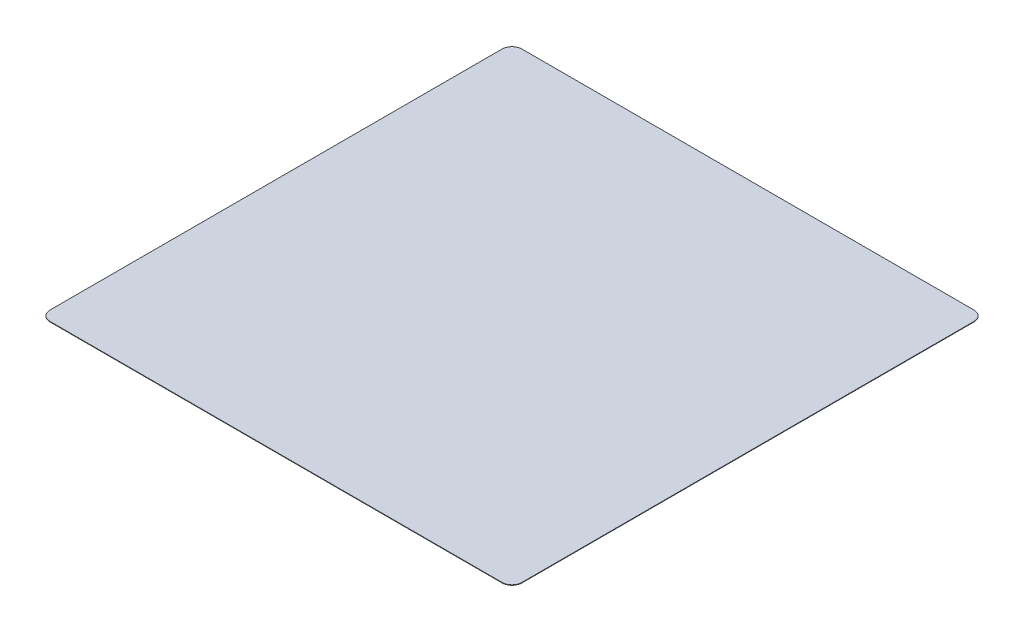
ISO-10303-21;
HEADER;
FILE_DESCRIPTION(('STEP AP214'),'2;1');
FILE_NAME('part.step','',(''),(''),'','','');
FILE_SCHEMA(('AUTOMOTIVE_DESIGN { 1 0 10303 214 1 1 1 1 }'));
ENDSEC;
DATA;
#1=APPLICATION_CONTEXT('core data for automotive mechanical design processes');
#2=APPLICATION_PROTOCOL_DEFINITION('international standard','automotive_design',2000,#1);
#3=PRODUCT_CONTEXT('',#1,'mechanical');
#4=PRODUCT('Part','Part','',(#3));
#5=PRODUCT_RELATED_PRODUCT_CATEGORY('part','',(#4));
#6=PRODUCT_DEFINITION_FORMATION('','',#4);
#7=PRODUCT_DEFINITION_CONTEXT('part definition',#1,'design');
#8=PRODUCT_DEFINITION('design','',#6,#7);
#9=PRODUCT_DEFINITION_SHAPE('','',#8);
#10=(LENGTH_UNIT() NAMED_UNIT(*) SI_UNIT(.MILLI.,.METRE.));
#11=(NAMED_UNIT(*) PLANE_ANGLE_UNIT() SI_UNIT($,.RADIAN.));
#12=(NAMED_UNIT(*) SI_UNIT($,.STERADIAN.) SOLID_ANGLE_UNIT());
#13=UNCERTAINTY_MEASURE_WITH_UNIT(LENGTH_MEASURE(1.E-05),#10,'distance_accuracy_value','');
#14=(GEOMETRIC_REPRESENTATION_CONTEXT(3) GLOBAL_UNCERTAINTY_ASSIGNED_CONTEXT((#13)) GLOBAL_UNIT_ASSIGNED_CONTEXT((#10,
#11,#12)) REPRESENTATION_CONTEXT('',''));
#15=CARTESIAN_POINT('',(0.,0.,0.));
#16=DIRECTION('',(0.,0.,1.));
#17=DIRECTION('',(1.,0.,0.));
#18=AXIS2_PLACEMENT_3D('',#15,#16,#17);
#19=CARTESIAN_POINT('',(47.35,0.1,47.35));
#20=DIRECTION('',(-1.,0.,0.));
#21=DIRECTION('',(0.,0.,1.));
#22=AXIS2_PLACEMENT_3D('',#19,#20,#21);
#23=PLANE('',#22);
#24=DIRECTION('',(0.,0.,-1.));
#25=VECTOR('',#24,1.);
#26=CARTESIAN_POINT('',(47.35,0.,47.35));
#27=LINE('',#26,#25);
#28=CARTESIAN_POINT('',(47.35,0.,45.35));
#29=VERTEX_POINT('',#28);
#30=CARTESIAN_POINT('',(47.35,0.,-45.35));
#31=VERTEX_POINT('',#30);
#32=EDGE_CURVE('E128',#29,#31,#27,.T.);
#33=ORIENTED_EDGE('',*,*,#32,.T.);
#34=DIRECTION('',(0.,-1.,0.));
#35=VECTOR('',#34,1.);
#36=CARTESIAN_POINT('',(47.35,0.1,-45.35));
#37=LINE('',#36,#35);
#38=CARTESIAN_POINT('',(47.35,0.1,-45.35));
#39=VERTEX_POINT('',#38);
#40=EDGE_CURVE('E151',#31,#39,#37,.F.);
#41=ORIENTED_EDGE('',*,*,#40,.T.);
#42=DIRECTION('',(0.,0.,-1.));
#43=VECTOR('',#42,1.);
#44=CARTESIAN_POINT('',(47.35,0.1,47.35));
#45=LINE('',#44,#43);
#46=CARTESIAN_POINT('',(47.35,0.1,45.35));
#47=VERTEX_POINT('',#46);
#48=EDGE_CURVE('E126',#47,#39,#45,.T.);
#49=ORIENTED_EDGE('',*,*,#48,.F.);
#50=DIRECTION('',(0.,-1.,0.));
#51=VECTOR('',#50,1.);
#52=CARTESIAN_POINT('',(47.35,0.1,45.35));
#53=LINE('',#52,#51);
#54=EDGE_CURVE('E148',#47,#29,#53,.T.);
#55=ORIENTED_EDGE('',*,*,#54,.T.);
#56=EDGE_LOOP('',(#33,#41,#49,#55));
#57=FACE_BOUND('',#56,.T.);
#58=ADVANCED_FACE('F33',(#57),#23,.F.);
#59=CARTESIAN_POINT('',(-47.35,0.1,-47.35));
#60=DIRECTION('',(0.,0.,1.));
#61=DIRECTION('',(1.,0.,0.));
#62=AXIS2_PLACEMENT_3D('',#59,#60,#61);
#63=PLANE('',#62);
#64=DIRECTION('',(-1.,0.,0.));
#65=VECTOR('',#64,1.);
#66=CARTESIAN_POINT('',(-47.35,0.,-47.35));
#67=LINE('',#66,#65);
#68=CARTESIAN_POINT('',(45.35,0.,-47.35));
#69=VERTEX_POINT('',#68);
#70=CARTESIAN_POINT('',(-45.35,0.,-47.35));
#71=VERTEX_POINT('',#70);
#72=EDGE_CURVE('E124',#69,#71,#67,.T.);
#73=ORIENTED_EDGE('',*,*,#72,.T.);
#74=DIRECTION('',(0.,-1.,0.));
#75=VECTOR('',#74,1.);
#76=CARTESIAN_POINT('',(-45.35,0.1,-47.35));
#77=LINE('',#76,#75);
#78=CARTESIAN_POINT('',(-45.35,0.1,-47.35));
#79=VERTEX_POINT('',#78);
#80=EDGE_CURVE('E103',#71,#79,#77,.F.);
#81=ORIENTED_EDGE('',*,*,#80,.T.);
#82=DIRECTION('',(-1.,0.,0.));
#83=VECTOR('',#82,1.);
#84=CARTESIAN_POINT('',(-47.35,0.1,-47.35));
#85=LINE('',#84,#83);
#86=CARTESIAN_POINT('',(45.35,0.1,-47.35));
#87=VERTEX_POINT('',#86);
#88=EDGE_CURVE('E167',#87,#79,#85,.T.);
#89=ORIENTED_EDGE('',*,*,#88,.F.);
#90=DIRECTION('',(0.,-1.,0.));
#91=VECTOR('',#90,1.);
#92=CARTESIAN_POINT('',(45.35,0.1,-47.35));
#93=LINE('',#92,#91);
#94=EDGE_CURVE('E108',#87,#69,#93,.T.);
#95=ORIENTED_EDGE('',*,*,#94,.T.);
#96=EDGE_LOOP('',(#73,#81,#89,#95));
#97=FACE_BOUND('',#96,.T.);
#98=ADVANCED_FACE('F184',(#97),#63,.F.);
#99=CARTESIAN_POINT('',(-47.35,0.1,47.35));
#100=DIRECTION('',(1.,0.,0.));
#101=DIRECTION('',(0.,0.,-1.));
#102=AXIS2_PLACEMENT_3D('',#99,#100,#101);
#103=PLANE('',#102);
#104=DIRECTION('',(0.,0.,1.));
#105=VECTOR('',#104,1.);
#106=CARTESIAN_POINT('',(-47.35,0.1,47.35));
#107=LINE('',#106,#105);
#108=CARTESIAN_POINT('',(-47.35,0.1,-45.35));
#109=VERTEX_POINT('',#108);
#110=CARTESIAN_POINT('',(-47.35,0.1,45.35));
#111=VERTEX_POINT('',#110);
#112=EDGE_CURVE('E117',#109,#111,#107,.T.);
#113=ORIENTED_EDGE('',*,*,#112,.F.);
#114=DIRECTION('',(0.,-1.,0.));
#115=VECTOR('',#114,1.);
#116=CARTESIAN_POINT('',(-47.35,0.1,-45.35));
#117=LINE('',#116,#115);
#118=CARTESIAN_POINT('',(-47.35,0.,-45.35));
#119=VERTEX_POINT('',#118);
#120=EDGE_CURVE('E102',#109,#119,#117,.T.);
#121=ORIENTED_EDGE('',*,*,#120,.T.);
#122=DIRECTION('',(0.,0.,1.));
#123=VECTOR('',#122,1.);
#124=CARTESIAN_POINT('',(-47.35,0.,47.35));
#125=LINE('',#124,#123);
#126=CARTESIAN_POINT('',(-47.35,0.,45.35));
#127=VERTEX_POINT('',#126);
#128=EDGE_CURVE('E115',#119,#127,#125,.T.);
#129=ORIENTED_EDGE('',*,*,#128,.T.);
#130=DIRECTION('',(0.,-1.,0.));
#131=VECTOR('',#130,1.);
#132=CARTESIAN_POINT('',(-47.35,0.1,45.35));
#133=LINE('',#132,#131);
#134=EDGE_CURVE('E119',#127,#111,#133,.F.);
#135=ORIENTED_EDGE('',*,*,#134,.T.);
#136=EDGE_LOOP('',(#113,#121,#129,#135));
#137=FACE_BOUND('',#136,.T.);
#138=ADVANCED_FACE('F114',(#137),#103,.F.);
#139=CARTESIAN_POINT('',(-47.35,0.1,47.35));
#140=DIRECTION('',(0.,0.,-1.));
#141=DIRECTION('',(-1.,0.,0.));
#142=AXIS2_PLACEMENT_3D('',#139,#140,#141);
#143=PLANE('',#142);
#144=DIRECTION('',(1.,0.,0.));
#145=VECTOR('',#144,1.);
#146=CARTESIAN_POINT('',(-47.35,0.,47.35));
#147=LINE('',#146,#145);
#148=CARTESIAN_POINT('',(-45.35,0.,47.35));
#149=VERTEX_POINT('',#148);
#150=CARTESIAN_POINT('',(45.35,0.,47.35));
#151=VERTEX_POINT('',#150);
#152=EDGE_CURVE('E123',#149,#151,#147,.T.);
#153=ORIENTED_EDGE('',*,*,#152,.T.);
#154=DIRECTION('',(0.,-1.,0.));
#155=VECTOR('',#154,1.);
#156=CARTESIAN_POINT('',(45.35,0.1,47.35));
#157=LINE('',#156,#155);
#158=CARTESIAN_POINT('',(45.35,0.1,47.35));
#159=VERTEX_POINT('',#158);
#160=EDGE_CURVE('E11',#151,#159,#157,.F.);
#161=ORIENTED_EDGE('',*,*,#160,.T.);
#162=DIRECTION('',(1.,0.,0.));
#163=VECTOR('',#162,1.);
#164=CARTESIAN_POINT('',(-47.35,0.1,47.35));
#165=LINE('',#164,#163);
#166=CARTESIAN_POINT('',(-45.35,0.1,47.35));
#167=VERTEX_POINT('',#166);
#168=EDGE_CURVE('E132',#167,#159,#165,.T.);
#169=ORIENTED_EDGE('',*,*,#168,.F.);
#170=DIRECTION('',(0.,-1.,0.));
#171=VECTOR('',#170,1.);
#172=CARTESIAN_POINT('',(-45.35,0.1,47.35));
#173=LINE('',#172,#171);
#174=EDGE_CURVE('E41',#167,#149,#173,.T.);
#175=ORIENTED_EDGE('',*,*,#174,.T.);
#176=EDGE_LOOP('',(#153,#161,#169,#175));
#177=FACE_BOUND('',#176,.T.);
#178=ADVANCED_FACE('F154',(#177),#143,.F.);
#179=CARTESIAN_POINT('',(0.,0.1,0.));
#180=DIRECTION('',(0.,-1.,0.));
#181=DIRECTION('',(0.,0.,-1.));
#182=AXIS2_PLACEMENT_3D('',#179,#180,#181);
#183=PLANE('',#182);
#184=ORIENTED_EDGE('',*,*,#88,.T.);
#185=CARTESIAN_POINT('',(-45.35,0.1,-45.35));
#186=DIRECTION('',(0.,-1.,0.));
#187=DIRECTION('',(0.,0.,-1.));
#188=AXIS2_PLACEMENT_3D('',#185,#186,#187);
#189=CIRCLE('',#188,2.);
#190=EDGE_CURVE('E146',#79,#109,#189,.F.);
#191=ORIENTED_EDGE('',*,*,#190,.T.);
#192=ORIENTED_EDGE('',*,*,#112,.T.);
#193=CARTESIAN_POINT('',(-45.35,0.1,45.35));
#194=DIRECTION('',(0.,-1.,0.));
#195=DIRECTION('',(0.,0.,-1.));
#196=AXIS2_PLACEMENT_3D('',#193,#194,#195);
#197=CIRCLE('',#196,2.);
#198=EDGE_CURVE('E53',#111,#167,#197,.F.);
#199=ORIENTED_EDGE('',*,*,#198,.T.);
#200=ORIENTED_EDGE('',*,*,#168,.T.);
#201=CARTESIAN_POINT('',(45.35,0.1,45.35));
#202=DIRECTION('',(0.,-1.,0.));
#203=DIRECTION('',(0.,0.,-1.));
#204=AXIS2_PLACEMENT_3D('',#201,#202,#203);
#205=CIRCLE('',#204,2.);
#206=EDGE_CURVE('E142',#159,#47,#205,.F.);
#207=ORIENTED_EDGE('',*,*,#206,.T.);
#208=ORIENTED_EDGE('',*,*,#48,.T.);
#209=CARTESIAN_POINT('',(45.35,0.1,-45.35));
#210=DIRECTION('',(0.,-1.,0.));
#211=DIRECTION('',(0.,0.,-1.));
#212=AXIS2_PLACEMENT_3D('',#209,#210,#211);
#213=CIRCLE('',#212,2.);
#214=EDGE_CURVE('E144',#39,#87,#213,.F.);
#215=ORIENTED_EDGE('',*,*,#214,.T.);
#216=EDGE_LOOP('',(#184,#191,#192,#199,#200,#207,#208,#215));
#217=FACE_BOUND('',#216,.T.);
#218=ADVANCED_FACE('F173',(#217),#183,.F.);
#219=CARTESIAN_POINT('',(0.,0.,0.));
#220=DIRECTION('',(0.,-1.,0.));
#221=DIRECTION('',(0.,0.,-1.));
#222=AXIS2_PLACEMENT_3D('',#219,#220,#221);
#223=PLANE('',#222);
#224=ORIENTED_EDGE('',*,*,#128,.F.);
#225=CARTESIAN_POINT('',(-45.35,0.,-45.35));
#226=DIRECTION('',(0.,-1.,0.));
#227=DIRECTION('',(0.,0.,-1.));
#228=AXIS2_PLACEMENT_3D('',#225,#226,#227);
#229=CIRCLE('',#228,2.);
#230=EDGE_CURVE('E98',#119,#71,#229,.T.);
#231=ORIENTED_EDGE('',*,*,#230,.T.);
#232=ORIENTED_EDGE('',*,*,#72,.F.);
#233=CARTESIAN_POINT('',(45.35,0.,-45.35));
#234=DIRECTION('',(0.,-1.,0.));
#235=DIRECTION('',(0.,0.,-1.));
#236=AXIS2_PLACEMENT_3D('',#233,#234,#235);
#237=CIRCLE('',#236,2.);
#238=EDGE_CURVE('E109',#69,#31,#237,.T.);
#239=ORIENTED_EDGE('',*,*,#238,.T.);
#240=ORIENTED_EDGE('',*,*,#32,.F.);
#241=CARTESIAN_POINT('',(45.35,0.,45.35));
#242=DIRECTION('',(0.,-1.,0.));
#243=DIRECTION('',(0.,0.,-1.));
#244=AXIS2_PLACEMENT_3D('',#241,#242,#243);
#245=CIRCLE('',#244,2.);
#246=EDGE_CURVE('E135',#29,#151,#245,.T.);
#247=ORIENTED_EDGE('',*,*,#246,.T.);
#248=ORIENTED_EDGE('',*,*,#152,.F.);
#249=CARTESIAN_POINT('',(-45.35,0.,45.35));
#250=DIRECTION('',(0.,-1.,0.));
#251=DIRECTION('',(0.,0.,-1.));
#252=AXIS2_PLACEMENT_3D('',#249,#250,#251);
#253=CIRCLE('',#252,2.);
#254=EDGE_CURVE('E118',#149,#127,#253,.T.);
#255=ORIENTED_EDGE('',*,*,#254,.T.);
#256=EDGE_LOOP('',(#224,#231,#232,#239,#240,#247,#248,#255));
#257=FACE_BOUND('',#256,.T.);
#258=ADVANCED_FACE('F121',(#257),#223,.T.);
#259=CARTESIAN_POINT('',(-45.35,0.1,-45.35));
#260=DIRECTION('',(0.,-1.,0.));
#261=DIRECTION('',(0.,0.,-1.));
#262=AXIS2_PLACEMENT_3D('',#259,#260,#261);
#263=CYLINDRICAL_SURFACE('',#262,2.);
#264=ORIENTED_EDGE('',*,*,#190,.F.);
#265=ORIENTED_EDGE('',*,*,#80,.F.);
#266=ORIENTED_EDGE('',*,*,#230,.F.);
#267=ORIENTED_EDGE('',*,*,#120,.F.);
#268=EDGE_LOOP('',(#264,#265,#266,#267));
#269=FACE_BOUND('',#268,.T.);
#270=ADVANCED_FACE('F101',(#269),#263,.T.);
#271=CARTESIAN_POINT('',(45.35,0.1,-45.35));
#272=DIRECTION('',(0.,-1.,0.));
#273=DIRECTION('',(0.,0.,-1.));
#274=AXIS2_PLACEMENT_3D('',#271,#272,#273);
#275=CYLINDRICAL_SURFACE('',#274,2.);
#276=ORIENTED_EDGE('',*,*,#214,.F.);
#277=ORIENTED_EDGE('',*,*,#40,.F.);
#278=ORIENTED_EDGE('',*,*,#238,.F.);
#279=ORIENTED_EDGE('',*,*,#94,.F.);
#280=EDGE_LOOP('',(#276,#277,#278,#279));
#281=FACE_BOUND('',#280,.T.);
#282=ADVANCED_FACE('F195',(#281),#275,.T.);
#283=CARTESIAN_POINT('',(45.35,0.1,45.35));
#284=DIRECTION('',(0.,-1.,0.));
#285=DIRECTION('',(0.,0.,-1.));
#286=AXIS2_PLACEMENT_3D('',#283,#284,#285);
#287=CYLINDRICAL_SURFACE('',#286,2.);
#288=ORIENTED_EDGE('',*,*,#206,.F.);
#289=ORIENTED_EDGE('',*,*,#160,.F.);
#290=ORIENTED_EDGE('',*,*,#246,.F.);
#291=ORIENTED_EDGE('',*,*,#54,.F.);
#292=EDGE_LOOP('',(#288,#289,#290,#291));
#293=FACE_BOUND('',#292,.T.);
#294=ADVANCED_FACE('F161',(#293),#287,.T.);
#295=CARTESIAN_POINT('',(-45.35,0.1,45.35));
#296=DIRECTION('',(0.,-1.,0.));
#297=DIRECTION('',(0.,0.,-1.));
#298=AXIS2_PLACEMENT_3D('',#295,#296,#297);
#299=CYLINDRICAL_SURFACE('',#298,2.);
#300=ORIENTED_EDGE('',*,*,#198,.F.);
#301=ORIENTED_EDGE('',*,*,#134,.F.);
#302=ORIENTED_EDGE('',*,*,#254,.F.);
#303=ORIENTED_EDGE('',*,*,#174,.F.);
#304=EDGE_LOOP('',(#300,#301,#302,#303));
#305=FACE_BOUND('',#304,.T.);
#306=ADVANCED_FACE('F35',(#305),#299,.T.);
#307=CLOSED_SHELL('',(#58,#98,#138,#178,#218,#258,#270,#282,#294,#306));
#308=MANIFOLD_SOLID_BREP('B2',#307);
#309=ADVANCED_BREP_SHAPE_REPRESENTATION('',(#18,#308),#14);
#310=SHAPE_DEFINITION_REPRESENTATION(#9,#309);
ENDSEC;
END-ISO-10303-21;
